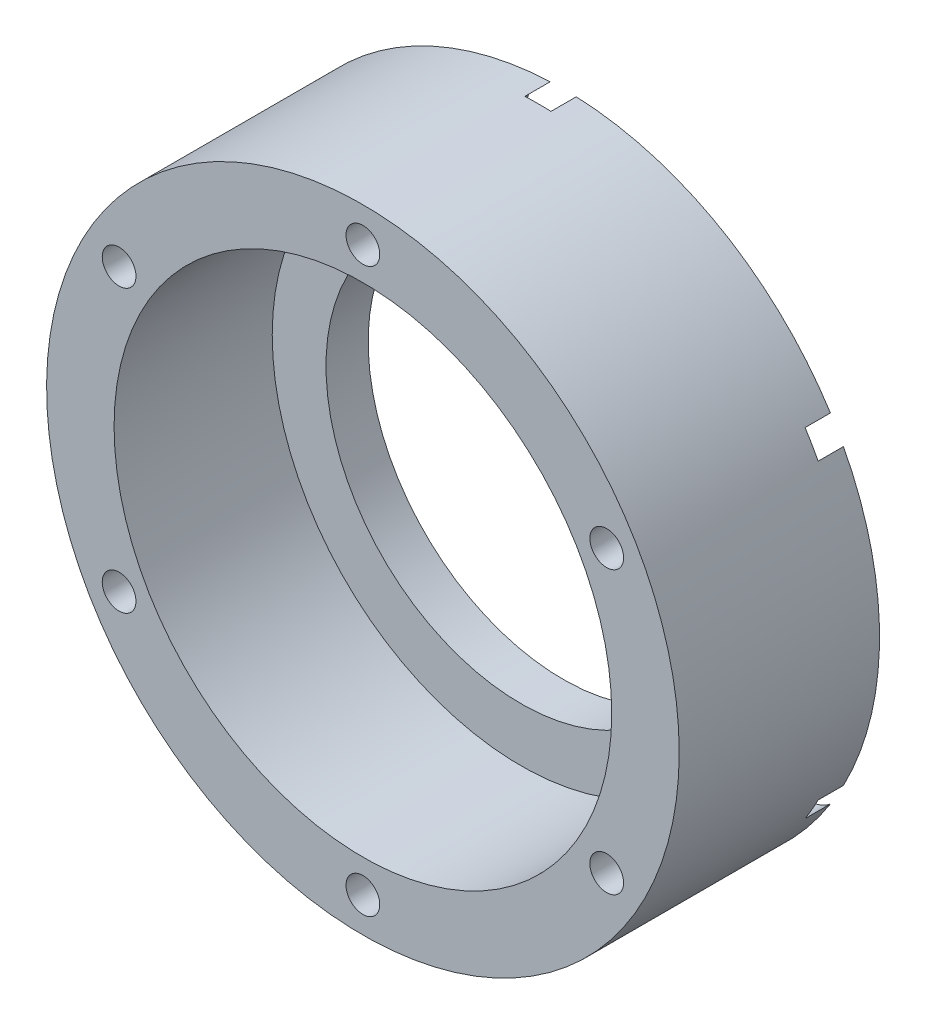
ISO-10303-21;
HEADER;
FILE_DESCRIPTION(('STEP AP214'),'2;1');
FILE_NAME('part.step','',(''),(''),'','','');
FILE_SCHEMA(('AUTOMOTIVE_DESIGN { 1 0 10303 214 1 1 1 1 }'));
ENDSEC;
DATA;
#1=APPLICATION_CONTEXT('core data for automotive mechanical design processes');
#2=APPLICATION_PROTOCOL_DEFINITION('international standard','automotive_design',2000,#1);
#3=PRODUCT_CONTEXT('',#1,'mechanical');
#4=PRODUCT('Part','Part','',(#3));
#5=PRODUCT_RELATED_PRODUCT_CATEGORY('part','',(#4));
#6=PRODUCT_DEFINITION_FORMATION('','',#4);
#7=PRODUCT_DEFINITION_CONTEXT('part definition',#1,'design');
#8=PRODUCT_DEFINITION('design','',#6,#7);
#9=PRODUCT_DEFINITION_SHAPE('','',#8);
#10=(LENGTH_UNIT() NAMED_UNIT(*) SI_UNIT(.MILLI.,.METRE.));
#11=(NAMED_UNIT(*) PLANE_ANGLE_UNIT() SI_UNIT($,.RADIAN.));
#12=(NAMED_UNIT(*) SI_UNIT($,.STERADIAN.) SOLID_ANGLE_UNIT());
#13=UNCERTAINTY_MEASURE_WITH_UNIT(LENGTH_MEASURE(1.E-05),#10,'distance_accuracy_value','');
#14=(GEOMETRIC_REPRESENTATION_CONTEXT(3) GLOBAL_UNCERTAINTY_ASSIGNED_CONTEXT((#13)) GLOBAL_UNIT_ASSIGNED_CONTEXT((#10,
#11,#12)) REPRESENTATION_CONTEXT('',''));
#15=CARTESIAN_POINT('',(0.,0.,0.));
#16=DIRECTION('',(0.,0.,1.));
#17=DIRECTION('',(1.,0.,0.));
#18=AXIS2_PLACEMENT_3D('',#15,#16,#17);
#19=CARTESIAN_POINT('',(0.,0.,0.));
#20=DIRECTION('',(0.,0.,1.));
#21=DIRECTION('',(1.,0.,0.));
#22=AXIS2_PLACEMENT_3D('',#19,#20,#21);
#23=PLANE('',#22);
#24=CARTESIAN_POINT('',(0.,0.,0.));
#25=DIRECTION('',(0.,0.,1.));
#26=DIRECTION('',(1.,0.,0.));
#27=AXIS2_PLACEMENT_3D('',#24,#25,#26);
#28=CIRCLE('',#27,18.5);
#29=CARTESIAN_POINT('',(18.5,0.,0.));
#30=VERTEX_POINT('',#29);
#31=EDGE_CURVE('E160',#30,#30,#28,.T.);
#32=ORIENTED_EDGE('',*,*,#31,.T.);
#33=EDGE_LOOP('',(#32));
#34=FACE_BOUND('',#33,.T.);
#35=CARTESIAN_POINT('',(0.,0.,0.));
#36=DIRECTION('',(0.,0.,1.));
#37=DIRECTION('',(1.,0.,0.));
#38=AXIS2_PLACEMENT_3D('',#35,#36,#37);
#39=CIRCLE('',#38,30.);
#40=CARTESIAN_POINT('',(25.3407575630178,16.0575840689799,0.));
#41=VERTEX_POINT('',#40);
#42=CARTESIAN_POINT('',(1.23589694563197,29.974531835206,0.));
#43=VERTEX_POINT('',#42);
#44=EDGE_CURVE('E145',#41,#43,#39,.T.);
#45=ORIENTED_EDGE('',*,*,#44,.F.);
#46=CARTESIAN_POINT('',(23.1228782810445,13.35,0.));
#47=DIRECTION('',(0.,0.,-1.));
#48=DIRECTION('',(-1.,0.,0.));
#49=AXIS2_PLACEMENT_3D('',#46,#47,#48);
#50=CIRCLE('',#49,3.5);
#51=CARTESIAN_POINT('',(26.5766545086498,13.9169477662261,0.));
#52=VERTEX_POINT('',#51);
#53=EDGE_CURVE('E134',#52,#41,#50,.T.);
#54=ORIENTED_EDGE('',*,*,#53,.F.);
#55=CARTESIAN_POINT('',(26.5766545086498,-13.9169477662261,0.));
#56=VERTEX_POINT('',#55);
#57=EDGE_CURVE('E140',#56,#52,#39,.T.);
#58=ORIENTED_EDGE('',*,*,#57,.F.);
#59=CARTESIAN_POINT('',(23.1228782810445,-13.35,0.));
#60=DIRECTION('',(0.,0.,-1.));
#61=DIRECTION('',(-1.,0.,0.));
#62=AXIS2_PLACEMENT_3D('',#59,#60,#61);
#63=CIRCLE('',#62,3.5);
#64=CARTESIAN_POINT('',(25.3407575630178,-16.0575840689799,0.));
#65=VERTEX_POINT('',#64);
#66=EDGE_CURVE('E184',#65,#56,#63,.T.);
#67=ORIENTED_EDGE('',*,*,#66,.F.);
#68=CARTESIAN_POINT('',(1.23589694563198,-29.974531835206,0.));
#69=VERTEX_POINT('',#68);
#70=EDGE_CURVE('E147',#69,#65,#39,.T.);
#71=ORIENTED_EDGE('',*,*,#70,.F.);
#72=CARTESIAN_POINT('',(0.,-26.7,0.));
#73=DIRECTION('',(0.,0.,-1.));
#74=DIRECTION('',(-1.,0.,0.));
#75=AXIS2_PLACEMENT_3D('',#72,#73,#74);
#76=CIRCLE('',#75,3.5);
#77=CARTESIAN_POINT('',(-1.23589694563198,-29.974531835206,0.));
#78=VERTEX_POINT('',#77);
#79=EDGE_CURVE('E195',#78,#69,#76,.T.);
#80=ORIENTED_EDGE('',*,*,#79,.F.);
#81=CARTESIAN_POINT('',(-25.3407575630178,-16.0575840689799,0.));
#82=VERTEX_POINT('',#81);
#83=EDGE_CURVE('E152',#82,#78,#39,.T.);
#84=ORIENTED_EDGE('',*,*,#83,.F.);
#85=CARTESIAN_POINT('',(-23.1228782810445,-13.35,0.));
#86=DIRECTION('',(0.,0.,-1.));
#87=DIRECTION('',(-1.,0.,0.));
#88=AXIS2_PLACEMENT_3D('',#85,#86,#87);
#89=CIRCLE('',#88,3.5);
#90=CARTESIAN_POINT('',(-26.5766545086498,-13.9169477662261,0.));
#91=VERTEX_POINT('',#90);
#92=EDGE_CURVE('E206',#91,#82,#89,.T.);
#93=ORIENTED_EDGE('',*,*,#92,.F.);
#94=CARTESIAN_POINT('',(-26.5766545086498,13.9169477662261,0.));
#95=VERTEX_POINT('',#94);
#96=EDGE_CURVE('E158',#95,#91,#39,.T.);
#97=ORIENTED_EDGE('',*,*,#96,.F.);
#98=CARTESIAN_POINT('',(-23.1228782810445,13.35,0.));
#99=DIRECTION('',(0.,0.,-1.));
#100=DIRECTION('',(-1.,0.,0.));
#101=AXIS2_PLACEMENT_3D('',#98,#99,#100);
#102=CIRCLE('',#101,3.5);
#103=CARTESIAN_POINT('',(-25.3407575630178,16.0575840689799,0.));
#104=VERTEX_POINT('',#103);
#105=EDGE_CURVE('E217',#104,#95,#102,.T.);
#106=ORIENTED_EDGE('',*,*,#105,.F.);
#107=CARTESIAN_POINT('',(-1.23589694563197,29.974531835206,0.));
#108=VERTEX_POINT('',#107);
#109=EDGE_CURVE('E150',#108,#104,#39,.T.);
#110=ORIENTED_EDGE('',*,*,#109,.F.);
#111=CARTESIAN_POINT('',(0.,26.7,0.));
#112=DIRECTION('',(0.,0.,-1.));
#113=DIRECTION('',(-1.,0.,0.));
#114=AXIS2_PLACEMENT_3D('',#111,#112,#113);
#115=CIRCLE('',#114,3.5);
#116=EDGE_CURVE('E226',#43,#108,#115,.T.);
#117=ORIENTED_EDGE('',*,*,#116,.F.);
#118=EDGE_LOOP('',(#45,#54,#58,#67,#71,#80,#84,#93,#97,#106,#110,#117));
#119=FACE_BOUND('',#118,.T.);
#120=ADVANCED_FACE('F37',(#34,#119),#23,.F.);
#121=CARTESIAN_POINT('',(0.,0.,19.));
#122=DIRECTION('',(0.,0.,1.));
#123=DIRECTION('',(1.,0.,0.));
#124=AXIS2_PLACEMENT_3D('',#121,#122,#123);
#125=PLANE('',#124);
#126=CARTESIAN_POINT('',(23.1228782810445,13.35,19.));
#127=DIRECTION('',(0.,0.,-1.));
#128=DIRECTION('',(-1.,0.,0.));
#129=AXIS2_PLACEMENT_3D('',#126,#127,#128);
#130=CIRCLE('',#129,1.59999999999999);
#131=CARTESIAN_POINT('',(21.5228782810445,13.35,19.));
#132=VERTEX_POINT('',#131);
#133=EDGE_CURVE('E228',#132,#132,#130,.T.);
#134=ORIENTED_EDGE('',*,*,#133,.T.);
#135=EDGE_LOOP('',(#134));
#136=FACE_BOUND('',#135,.T.);
#137=CARTESIAN_POINT('',(0.,26.7,19.));
#138=DIRECTION('',(0.,0.,-1.));
#139=DIRECTION('',(-1.,0.,0.));
#140=AXIS2_PLACEMENT_3D('',#137,#138,#139);
#141=CIRCLE('',#140,1.6);
#142=CARTESIAN_POINT('',(-1.59999999999999,26.7,19.));
#143=VERTEX_POINT('',#142);
#144=EDGE_CURVE('E219',#143,#143,#141,.T.);
#145=ORIENTED_EDGE('',*,*,#144,.T.);
#146=EDGE_LOOP('',(#145));
#147=FACE_BOUND('',#146,.T.);
#148=CARTESIAN_POINT('',(-23.1228782810445,13.35,19.));
#149=DIRECTION('',(0.,0.,-1.));
#150=DIRECTION('',(-1.,0.,0.));
#151=AXIS2_PLACEMENT_3D('',#148,#149,#150);
#152=CIRCLE('',#151,1.59999999999999);
#153=CARTESIAN_POINT('',(-24.7228782810445,13.35,19.));
#154=VERTEX_POINT('',#153);
#155=EDGE_CURVE('E208',#154,#154,#152,.T.);
#156=ORIENTED_EDGE('',*,*,#155,.T.);
#157=EDGE_LOOP('',(#156));
#158=FACE_BOUND('',#157,.T.);
#159=CARTESIAN_POINT('',(-23.1228782810445,-13.35,19.));
#160=DIRECTION('',(0.,0.,-1.));
#161=DIRECTION('',(-1.,0.,0.));
#162=AXIS2_PLACEMENT_3D('',#159,#160,#161);
#163=CIRCLE('',#162,1.59999999999999);
#164=CARTESIAN_POINT('',(-24.7228782810445,-13.35,19.));
#165=VERTEX_POINT('',#164);
#166=EDGE_CURVE('E197',#165,#165,#163,.T.);
#167=ORIENTED_EDGE('',*,*,#166,.T.);
#168=EDGE_LOOP('',(#167));
#169=FACE_BOUND('',#168,.T.);
#170=CARTESIAN_POINT('',(0.,-26.7,19.));
#171=DIRECTION('',(0.,0.,-1.));
#172=DIRECTION('',(-1.,0.,0.));
#173=AXIS2_PLACEMENT_3D('',#170,#171,#172);
#174=CIRCLE('',#173,1.6);
#175=CARTESIAN_POINT('',(-1.6,-26.7,19.));
#176=VERTEX_POINT('',#175);
#177=EDGE_CURVE('E186',#176,#176,#174,.T.);
#178=ORIENTED_EDGE('',*,*,#177,.T.);
#179=EDGE_LOOP('',(#178));
#180=FACE_BOUND('',#179,.T.);
#181=CARTESIAN_POINT('',(0.,0.,19.));
#182=DIRECTION('',(0.,0.,1.));
#183=DIRECTION('',(1.,0.,0.));
#184=AXIS2_PLACEMENT_3D('',#181,#182,#183);
#185=CIRCLE('',#184,23.6);
#186=CARTESIAN_POINT('',(23.6,0.,19.));
#187=VERTEX_POINT('',#186);
#188=EDGE_CURVE('E169',#187,#187,#185,.T.);
#189=ORIENTED_EDGE('',*,*,#188,.F.);
#190=EDGE_LOOP('',(#189));
#191=FACE_BOUND('',#190,.T.);
#192=CARTESIAN_POINT('',(0.,0.,19.));
#193=DIRECTION('',(0.,0.,1.));
#194=DIRECTION('',(1.,0.,0.));
#195=AXIS2_PLACEMENT_3D('',#192,#193,#194);
#196=CIRCLE('',#195,30.);
#197=CARTESIAN_POINT('',(30.,0.,19.));
#198=VERTEX_POINT('',#197);
#199=EDGE_CURVE('E165',#198,#198,#196,.T.);
#200=ORIENTED_EDGE('',*,*,#199,.T.);
#201=EDGE_LOOP('',(#200));
#202=FACE_BOUND('',#201,.T.);
#203=CARTESIAN_POINT('',(23.1228782810445,-13.35,19.));
#204=DIRECTION('',(0.,0.,-1.));
#205=DIRECTION('',(-1.,0.,0.));
#206=AXIS2_PLACEMENT_3D('',#203,#204,#205);
#207=CIRCLE('',#206,1.59999999999999);
#208=CARTESIAN_POINT('',(21.5228782810445,-13.35,19.));
#209=VERTEX_POINT('',#208);
#210=EDGE_CURVE('E173',#209,#209,#207,.T.);
#211=ORIENTED_EDGE('',*,*,#210,.T.);
#212=EDGE_LOOP('',(#211));
#213=FACE_BOUND('',#212,.T.);
#214=ADVANCED_FACE('F307',(#136,#147,#158,#169,#180,#191,#202,#213),#125,.T.);
#215=CARTESIAN_POINT('',(0.,0.,4.));
#216=DIRECTION('',(0.,0.,1.));
#217=DIRECTION('',(1.,0.,0.));
#218=AXIS2_PLACEMENT_3D('',#215,#216,#217);
#219=PLANE('',#218);
#220=CARTESIAN_POINT('',(0.,0.,4.));
#221=DIRECTION('',(0.,0.,1.));
#222=DIRECTION('',(1.,0.,0.));
#223=AXIS2_PLACEMENT_3D('',#220,#221,#222);
#224=CIRCLE('',#223,18.5);
#225=CARTESIAN_POINT('',(18.5,0.,4.));
#226=VERTEX_POINT('',#225);
#227=EDGE_CURVE('E153',#226,#226,#224,.T.);
#228=ORIENTED_EDGE('',*,*,#227,.F.);
#229=EDGE_LOOP('',(#228));
#230=FACE_BOUND('',#229,.T.);
#231=CARTESIAN_POINT('',(0.,0.,4.));
#232=DIRECTION('',(0.,0.,1.));
#233=DIRECTION('',(1.,0.,0.));
#234=AXIS2_PLACEMENT_3D('',#231,#232,#233);
#235=CIRCLE('',#234,23.6);
#236=CARTESIAN_POINT('',(23.6,0.,4.));
#237=VERTEX_POINT('',#236);
#238=EDGE_CURVE('E170',#237,#237,#235,.T.);
#239=ORIENTED_EDGE('',*,*,#238,.T.);
#240=EDGE_LOOP('',(#239));
#241=FACE_BOUND('',#240,.T.);
#242=ADVANCED_FACE('F312',(#230,#241),#219,.T.);
#243=CARTESIAN_POINT('',(0.,0.,4.));
#244=DIRECTION('',(0.,0.,-1.));
#245=DIRECTION('',(-1.,0.,0.));
#246=AXIS2_PLACEMENT_3D('',#243,#244,#245);
#247=CYLINDRICAL_SURFACE('',#246,30.);
#248=ORIENTED_EDGE('',*,*,#57,.T.);
#249=DIRECTION('',(0.,0.,-1.));
#250=VECTOR('',#249,1.);
#251=CARTESIAN_POINT('',(26.5766545086498,13.9169477662261,1.2));
#252=LINE('',#251,#250);
#253=CARTESIAN_POINT('',(26.5766545086498,13.9169477662261,2.4));
#254=VERTEX_POINT('',#253);
#255=EDGE_CURVE('E11',#52,#254,#252,.F.);
#256=ORIENTED_EDGE('',*,*,#255,.T.);
#257=CARTESIAN_POINT('',(0.,0.,2.4));
#258=DIRECTION('',(0.,0.,1.));
#259=DIRECTION('',(1.,0.,0.));
#260=AXIS2_PLACEMENT_3D('',#257,#258,#259);
#261=CIRCLE('',#260,30.);
#262=CARTESIAN_POINT('',(25.3407575630178,16.0575840689799,2.4));
#263=VERTEX_POINT('',#262);
#264=EDGE_CURVE('E124',#254,#263,#261,.T.);
#265=ORIENTED_EDGE('',*,*,#264,.T.);
#266=DIRECTION('',(0.,0.,-1.));
#267=VECTOR('',#266,1.);
#268=CARTESIAN_POINT('',(25.3407575630178,16.0575840689799,1.2));
#269=LINE('',#268,#267);
#270=EDGE_CURVE('E45',#263,#41,#269,.T.);
#271=ORIENTED_EDGE('',*,*,#270,.T.);
#272=ORIENTED_EDGE('',*,*,#44,.T.);
#273=DIRECTION('',(0.,0.,-1.));
#274=VECTOR('',#273,1.);
#275=CARTESIAN_POINT('',(1.23589694563198,29.974531835206,1.2));
#276=LINE('',#275,#274);
#277=CARTESIAN_POINT('',(1.23589694563197,29.974531835206,2.4));
#278=VERTEX_POINT('',#277);
#279=EDGE_CURVE('E128',#43,#278,#276,.F.);
#280=ORIENTED_EDGE('',*,*,#279,.T.);
#281=CARTESIAN_POINT('',(0.,0.,2.4));
#282=DIRECTION('',(0.,0.,1.));
#283=DIRECTION('',(1.,0.,0.));
#284=AXIS2_PLACEMENT_3D('',#281,#282,#283);
#285=CIRCLE('',#284,30.);
#286=CARTESIAN_POINT('',(-1.23589694563197,29.974531835206,2.4));
#287=VERTEX_POINT('',#286);
#288=EDGE_CURVE('E246',#278,#287,#285,.T.);
#289=ORIENTED_EDGE('',*,*,#288,.T.);
#290=DIRECTION('',(0.,0.,-1.));
#291=VECTOR('',#290,1.);
#292=CARTESIAN_POINT('',(-1.23589694563198,29.974531835206,1.2));
#293=LINE('',#292,#291);
#294=EDGE_CURVE('E242',#287,#108,#293,.T.);
#295=ORIENTED_EDGE('',*,*,#294,.T.);
#296=ORIENTED_EDGE('',*,*,#109,.T.);
#297=DIRECTION('',(0.,0.,-1.));
#298=VECTOR('',#297,1.);
#299=CARTESIAN_POINT('',(-25.3407575630178,16.0575840689799,1.2));
#300=LINE('',#299,#298);
#301=CARTESIAN_POINT('',(-25.3407575630178,16.0575840689799,2.4));
#302=VERTEX_POINT('',#301);
#303=EDGE_CURVE('E249',#104,#302,#300,.F.);
#304=ORIENTED_EDGE('',*,*,#303,.T.);
#305=CARTESIAN_POINT('',(0.,0.,2.4));
#306=DIRECTION('',(0.,0.,1.));
#307=DIRECTION('',(1.,0.,0.));
#308=AXIS2_PLACEMENT_3D('',#305,#306,#307);
#309=CIRCLE('',#308,30.);
#310=CARTESIAN_POINT('',(-26.5766545086498,13.9169477662261,2.4));
#311=VERTEX_POINT('',#310);
#312=EDGE_CURVE('E253',#302,#311,#309,.T.);
#313=ORIENTED_EDGE('',*,*,#312,.T.);
#314=DIRECTION('',(0.,0.,-1.));
#315=VECTOR('',#314,1.);
#316=CARTESIAN_POINT('',(-26.5766545086498,13.9169477662261,1.2));
#317=LINE('',#316,#315);
#318=EDGE_CURVE('E256',#311,#95,#317,.T.);
#319=ORIENTED_EDGE('',*,*,#318,.T.);
#320=ORIENTED_EDGE('',*,*,#96,.T.);
#321=DIRECTION('',(0.,0.,-1.));
#322=VECTOR('',#321,1.);
#323=CARTESIAN_POINT('',(-26.5766545086498,-13.9169477662261,1.2));
#324=LINE('',#323,#322);
#325=CARTESIAN_POINT('',(-26.5766545086498,-13.9169477662261,2.4));
#326=VERTEX_POINT('',#325);
#327=EDGE_CURVE('E259',#91,#326,#324,.F.);
#328=ORIENTED_EDGE('',*,*,#327,.T.);
#329=CARTESIAN_POINT('',(0.,0.,2.4));
#330=DIRECTION('',(0.,0.,1.));
#331=DIRECTION('',(1.,0.,0.));
#332=AXIS2_PLACEMENT_3D('',#329,#330,#331);
#333=CIRCLE('',#332,30.);
#334=CARTESIAN_POINT('',(-25.3407575630178,-16.0575840689799,2.4));
#335=VERTEX_POINT('',#334);
#336=EDGE_CURVE('E262',#326,#335,#333,.T.);
#337=ORIENTED_EDGE('',*,*,#336,.T.);
#338=DIRECTION('',(0.,0.,-1.));
#339=VECTOR('',#338,1.);
#340=CARTESIAN_POINT('',(-25.3407575630178,-16.0575840689799,1.2));
#341=LINE('',#340,#339);
#342=EDGE_CURVE('E265',#335,#82,#341,.T.);
#343=ORIENTED_EDGE('',*,*,#342,.T.);
#344=ORIENTED_EDGE('',*,*,#83,.T.);
#345=DIRECTION('',(0.,0.,-1.));
#346=VECTOR('',#345,1.);
#347=CARTESIAN_POINT('',(-1.23589694563198,-29.974531835206,1.2));
#348=LINE('',#347,#346);
#349=CARTESIAN_POINT('',(-1.23589694563198,-29.974531835206,2.4));
#350=VERTEX_POINT('',#349);
#351=EDGE_CURVE('E268',#78,#350,#348,.F.);
#352=ORIENTED_EDGE('',*,*,#351,.T.);
#353=CARTESIAN_POINT('',(0.,0.,2.4));
#354=DIRECTION('',(0.,0.,1.));
#355=DIRECTION('',(1.,0.,0.));
#356=AXIS2_PLACEMENT_3D('',#353,#354,#355);
#357=CIRCLE('',#356,30.);
#358=CARTESIAN_POINT('',(1.23589694563198,-29.974531835206,2.4));
#359=VERTEX_POINT('',#358);
#360=EDGE_CURVE('E271',#350,#359,#357,.T.);
#361=ORIENTED_EDGE('',*,*,#360,.T.);
#362=DIRECTION('',(0.,0.,-1.));
#363=VECTOR('',#362,1.);
#364=CARTESIAN_POINT('',(1.23589694563197,-29.974531835206,1.2));
#365=LINE('',#364,#363);
#366=EDGE_CURVE('E274',#359,#69,#365,.T.);
#367=ORIENTED_EDGE('',*,*,#366,.T.);
#368=ORIENTED_EDGE('',*,*,#70,.T.);
#369=DIRECTION('',(0.,0.,-1.));
#370=VECTOR('',#369,1.);
#371=CARTESIAN_POINT('',(25.3407575630178,-16.0575840689799,1.2));
#372=LINE('',#371,#370);
#373=CARTESIAN_POINT('',(25.3407575630178,-16.0575840689799,2.4));
#374=VERTEX_POINT('',#373);
#375=EDGE_CURVE('E276',#65,#374,#372,.F.);
#376=ORIENTED_EDGE('',*,*,#375,.T.);
#377=CARTESIAN_POINT('',(0.,0.,2.4));
#378=DIRECTION('',(0.,0.,1.));
#379=DIRECTION('',(1.,0.,0.));
#380=AXIS2_PLACEMENT_3D('',#377,#378,#379);
#381=CIRCLE('',#380,30.);
#382=CARTESIAN_POINT('',(26.5766545086498,-13.9169477662261,2.4));
#383=VERTEX_POINT('',#382);
#384=EDGE_CURVE('E148',#374,#383,#381,.T.);
#385=ORIENTED_EDGE('',*,*,#384,.T.);
#386=DIRECTION('',(0.,0.,-1.));
#387=VECTOR('',#386,1.);
#388=CARTESIAN_POINT('',(26.5766545086498,-13.9169477662261,1.2));
#389=LINE('',#388,#387);
#390=EDGE_CURVE('E142',#383,#56,#389,.T.);
#391=ORIENTED_EDGE('',*,*,#390,.T.);
#392=EDGE_LOOP('',(#248,#256,#265,#271,#272,#280,#289,#295,#296,#304,#313,#319,#320,#328,#337,
#343,#344,#352,#361,#367,#368,#376,#385,#391));
#393=FACE_BOUND('',#392,.T.);
#394=ORIENTED_EDGE('',*,*,#199,.F.);
#395=EDGE_LOOP('',(#394));
#396=FACE_BOUND('',#395,.T.);
#397=ADVANCED_FACE('F39',(#393,#396),#247,.T.);
#398=CARTESIAN_POINT('',(0.,0.,4.));
#399=DIRECTION('',(0.,0.,-1.));
#400=DIRECTION('',(-1.,0.,0.));
#401=AXIS2_PLACEMENT_3D('',#398,#399,#400);
#402=CYLINDRICAL_SURFACE('',#401,18.5);
#403=ORIENTED_EDGE('',*,*,#227,.T.);
#404=EDGE_LOOP('',(#403));
#405=FACE_BOUND('',#404,.T.);
#406=ORIENTED_EDGE('',*,*,#31,.F.);
#407=EDGE_LOOP('',(#406));
#408=FACE_BOUND('',#407,.T.);
#409=ADVANCED_FACE('F319',(#405,#408),#402,.F.);
#410=CARTESIAN_POINT('',(0.,0.,19.));
#411=DIRECTION('',(0.,0.,-1.));
#412=DIRECTION('',(-1.,0.,0.));
#413=AXIS2_PLACEMENT_3D('',#410,#411,#412);
#414=CYLINDRICAL_SURFACE('',#413,23.6);
#415=ORIENTED_EDGE('',*,*,#188,.T.);
#416=EDGE_LOOP('',(#415));
#417=FACE_BOUND('',#416,.T.);
#418=ORIENTED_EDGE('',*,*,#238,.F.);
#419=EDGE_LOOP('',(#418));
#420=FACE_BOUND('',#419,.T.);
#421=ADVANCED_FACE('F321',(#417,#420),#414,.F.);
#422=CARTESIAN_POINT('',(24.7228782810445,-13.35,2.4));
#423=DIRECTION('',(0.,0.,1.));
#424=DIRECTION('',(1.,0.,0.));
#425=AXIS2_PLACEMENT_3D('',#422,#423,#424);
#426=PLANE('',#425);
#427=CARTESIAN_POINT('',(23.1228782810445,-13.35,2.4));
#428=DIRECTION('',(0.,0.,-1.));
#429=DIRECTION('',(-1.,0.,0.));
#430=AXIS2_PLACEMENT_3D('',#427,#428,#429);
#431=CIRCLE('',#430,1.60000000000001);
#432=CARTESIAN_POINT('',(21.5228782810445,-13.35,2.4));
#433=VERTEX_POINT('',#432);
#434=EDGE_CURVE('E178',#433,#433,#431,.T.);
#435=ORIENTED_EDGE('',*,*,#434,.F.);
#436=EDGE_LOOP('',(#435));
#437=FACE_BOUND('',#436,.T.);
#438=CARTESIAN_POINT('',(23.1228782810445,-13.35,2.4));
#439=DIRECTION('',(0.,0.,-1.));
#440=DIRECTION('',(-1.,0.,0.));
#441=AXIS2_PLACEMENT_3D('',#438,#439,#440);
#442=CIRCLE('',#441,3.5);
#443=EDGE_CURVE('E181',#374,#383,#442,.T.);
#444=ORIENTED_EDGE('',*,*,#443,.T.);
#445=ORIENTED_EDGE('',*,*,#384,.F.);
#446=EDGE_LOOP('',(#444,#445));
#447=FACE_BOUND('',#446,.T.);
#448=ADVANCED_FACE('F280',(#437,#447),#426,.F.);
#449=CARTESIAN_POINT('',(23.1228782810445,-13.35,0.));
#450=DIRECTION('',(0.,0.,-1.));
#451=DIRECTION('',(-1.,0.,0.));
#452=AXIS2_PLACEMENT_3D('',#449,#450,#451);
#453=CYLINDRICAL_SURFACE('',#452,3.5);
#454=ORIENTED_EDGE('',*,*,#66,.T.);
#455=ORIENTED_EDGE('',*,*,#390,.F.);
#456=ORIENTED_EDGE('',*,*,#443,.F.);
#457=ORIENTED_EDGE('',*,*,#375,.F.);
#458=EDGE_LOOP('',(#454,#455,#456,#457));
#459=FACE_BOUND('',#458,.T.);
#460=ADVANCED_FACE('F282',(#459),#453,.F.);
#461=CARTESIAN_POINT('',(23.1228782810445,-13.35,0.));
#462=DIRECTION('',(0.,0.,-1.));
#463=DIRECTION('',(-1.,0.,0.));
#464=AXIS2_PLACEMENT_3D('',#461,#462,#463);
#465=CYLINDRICAL_SURFACE('',#464,1.6);
#466=ORIENTED_EDGE('',*,*,#210,.F.);
#467=EDGE_LOOP('',(#466));
#468=FACE_BOUND('',#467,.T.);
#469=ORIENTED_EDGE('',*,*,#434,.T.);
#470=EDGE_LOOP('',(#469));
#471=FACE_BOUND('',#470,.T.);
#472=ADVANCED_FACE('F293',(#468,#471),#465,.F.);
#473=CARTESIAN_POINT('',(1.60000000000001,-26.7,2.4));
#474=DIRECTION('',(0.,0.,1.));
#475=DIRECTION('',(1.,0.,0.));
#476=AXIS2_PLACEMENT_3D('',#473,#474,#475);
#477=PLANE('',#476);
#478=CARTESIAN_POINT('',(0.,-26.7,2.4));
#479=DIRECTION('',(0.,0.,-1.));
#480=DIRECTION('',(-1.,0.,0.));
#481=AXIS2_PLACEMENT_3D('',#478,#479,#480);
#482=CIRCLE('',#481,1.60000000000001);
#483=CARTESIAN_POINT('',(-1.60000000000002,-26.7,2.4));
#484=VERTEX_POINT('',#483);
#485=EDGE_CURVE('E189',#484,#484,#482,.T.);
#486=ORIENTED_EDGE('',*,*,#485,.F.);
#487=EDGE_LOOP('',(#486));
#488=FACE_BOUND('',#487,.T.);
#489=CARTESIAN_POINT('',(0.,-26.7,2.4));
#490=DIRECTION('',(0.,0.,-1.));
#491=DIRECTION('',(-1.,0.,0.));
#492=AXIS2_PLACEMENT_3D('',#489,#490,#491);
#493=CIRCLE('',#492,3.5);
#494=EDGE_CURVE('E192',#350,#359,#493,.T.);
#495=ORIENTED_EDGE('',*,*,#494,.T.);
#496=ORIENTED_EDGE('',*,*,#360,.F.);
#497=EDGE_LOOP('',(#495,#496));
#498=FACE_BOUND('',#497,.T.);
#499=ADVANCED_FACE('F291',(#488,#498),#477,.F.);
#500=CARTESIAN_POINT('',(0.,-26.7,0.));
#501=DIRECTION('',(0.,0.,-1.));
#502=DIRECTION('',(-1.,0.,0.));
#503=AXIS2_PLACEMENT_3D('',#500,#501,#502);
#504=CYLINDRICAL_SURFACE('',#503,3.5);
#505=ORIENTED_EDGE('',*,*,#79,.T.);
#506=ORIENTED_EDGE('',*,*,#366,.F.);
#507=ORIENTED_EDGE('',*,*,#494,.F.);
#508=ORIENTED_EDGE('',*,*,#351,.F.);
#509=EDGE_LOOP('',(#505,#506,#507,#508));
#510=FACE_BOUND('',#509,.T.);
#511=ADVANCED_FACE('F288',(#510),#504,.F.);
#512=CARTESIAN_POINT('',(0.,-26.7,0.));
#513=DIRECTION('',(0.,0.,-1.));
#514=DIRECTION('',(-1.,0.,0.));
#515=AXIS2_PLACEMENT_3D('',#512,#513,#514);
#516=CYLINDRICAL_SURFACE('',#515,1.6);
#517=ORIENTED_EDGE('',*,*,#177,.F.);
#518=EDGE_LOOP('',(#517));
#519=FACE_BOUND('',#518,.T.);
#520=ORIENTED_EDGE('',*,*,#485,.T.);
#521=EDGE_LOOP('',(#520));
#522=FACE_BOUND('',#521,.T.);
#523=ADVANCED_FACE('F300',(#519,#522),#516,.F.);
#524=CARTESIAN_POINT('',(-21.5228782810445,-13.35,2.4));
#525=DIRECTION('',(0.,0.,1.));
#526=DIRECTION('',(1.,0.,0.));
#527=AXIS2_PLACEMENT_3D('',#524,#525,#526);
#528=PLANE('',#527);
#529=CARTESIAN_POINT('',(-23.1228782810445,-13.35,2.4));
#530=DIRECTION('',(0.,0.,-1.));
#531=DIRECTION('',(-1.,0.,0.));
#532=AXIS2_PLACEMENT_3D('',#529,#530,#531);
#533=CIRCLE('',#532,1.60000000000001);
#534=CARTESIAN_POINT('',(-24.7228782810445,-13.35,2.4));
#535=VERTEX_POINT('',#534);
#536=EDGE_CURVE('E200',#535,#535,#533,.T.);
#537=ORIENTED_EDGE('',*,*,#536,.F.);
#538=EDGE_LOOP('',(#537));
#539=FACE_BOUND('',#538,.T.);
#540=CARTESIAN_POINT('',(-23.1228782810445,-13.35,2.4));
#541=DIRECTION('',(0.,0.,-1.));
#542=DIRECTION('',(-1.,0.,0.));
#543=AXIS2_PLACEMENT_3D('',#540,#541,#542);
#544=CIRCLE('',#543,3.5);
#545=EDGE_CURVE('E203',#326,#335,#544,.T.);
#546=ORIENTED_EDGE('',*,*,#545,.T.);
#547=ORIENTED_EDGE('',*,*,#336,.F.);
#548=EDGE_LOOP('',(#546,#547));
#549=FACE_BOUND('',#548,.T.);
#550=ADVANCED_FACE('F331',(#539,#549),#528,.F.);
#551=CARTESIAN_POINT('',(-23.1228782810445,-13.35,0.));
#552=DIRECTION('',(0.,0.,-1.));
#553=DIRECTION('',(-1.,0.,0.));
#554=AXIS2_PLACEMENT_3D('',#551,#552,#553);
#555=CYLINDRICAL_SURFACE('',#554,3.5);
#556=ORIENTED_EDGE('',*,*,#92,.T.);
#557=ORIENTED_EDGE('',*,*,#342,.F.);
#558=ORIENTED_EDGE('',*,*,#545,.F.);
#559=ORIENTED_EDGE('',*,*,#327,.F.);
#560=EDGE_LOOP('',(#556,#557,#558,#559));
#561=FACE_BOUND('',#560,.T.);
#562=ADVANCED_FACE('F336',(#561),#555,.F.);
#563=CARTESIAN_POINT('',(-23.1228782810445,-13.35,0.));
#564=DIRECTION('',(0.,0.,-1.));
#565=DIRECTION('',(-1.,0.,0.));
#566=AXIS2_PLACEMENT_3D('',#563,#564,#565);
#567=CYLINDRICAL_SURFACE('',#566,1.6);
#568=ORIENTED_EDGE('',*,*,#166,.F.);
#569=EDGE_LOOP('',(#568));
#570=FACE_BOUND('',#569,.T.);
#571=ORIENTED_EDGE('',*,*,#536,.T.);
#572=EDGE_LOOP('',(#571));
#573=FACE_BOUND('',#572,.T.);
#574=ADVANCED_FACE('F410',(#570,#573),#567,.F.);
#575=CARTESIAN_POINT('',(-21.5228782810445,13.35,2.4));
#576=DIRECTION('',(0.,0.,1.));
#577=DIRECTION('',(1.,0.,0.));
#578=AXIS2_PLACEMENT_3D('',#575,#576,#577);
#579=PLANE('',#578);
#580=CARTESIAN_POINT('',(-23.1228782810445,13.35,2.4));
#581=DIRECTION('',(0.,0.,-1.));
#582=DIRECTION('',(-1.,0.,0.));
#583=AXIS2_PLACEMENT_3D('',#580,#581,#582);
#584=CIRCLE('',#583,1.60000000000001);
#585=CARTESIAN_POINT('',(-24.7228782810445,13.35,2.4));
#586=VERTEX_POINT('',#585);
#587=EDGE_CURVE('E211',#586,#586,#584,.T.);
#588=ORIENTED_EDGE('',*,*,#587,.F.);
#589=EDGE_LOOP('',(#588));
#590=FACE_BOUND('',#589,.T.);
#591=CARTESIAN_POINT('',(-23.1228782810445,13.35,2.4));
#592=DIRECTION('',(0.,0.,-1.));
#593=DIRECTION('',(-1.,0.,0.));
#594=AXIS2_PLACEMENT_3D('',#591,#592,#593);
#595=CIRCLE('',#594,3.5);
#596=EDGE_CURVE('E214',#302,#311,#595,.T.);
#597=ORIENTED_EDGE('',*,*,#596,.T.);
#598=ORIENTED_EDGE('',*,*,#312,.F.);
#599=EDGE_LOOP('',(#597,#598));
#600=FACE_BOUND('',#599,.T.);
#601=ADVANCED_FACE('F421',(#590,#600),#579,.F.);
#602=CARTESIAN_POINT('',(-23.1228782810445,13.35,0.));
#603=DIRECTION('',(0.,0.,-1.));
#604=DIRECTION('',(-1.,0.,0.));
#605=AXIS2_PLACEMENT_3D('',#602,#603,#604);
#606=CYLINDRICAL_SURFACE('',#605,3.5);
#607=ORIENTED_EDGE('',*,*,#105,.T.);
#608=ORIENTED_EDGE('',*,*,#318,.F.);
#609=ORIENTED_EDGE('',*,*,#596,.F.);
#610=ORIENTED_EDGE('',*,*,#303,.F.);
#611=EDGE_LOOP('',(#607,#608,#609,#610));
#612=FACE_BOUND('',#611,.T.);
#613=ADVANCED_FACE('F432',(#612),#606,.F.);
#614=CARTESIAN_POINT('',(-23.1228782810445,13.35,0.));
#615=DIRECTION('',(0.,0.,-1.));
#616=DIRECTION('',(-1.,0.,0.));
#617=AXIS2_PLACEMENT_3D('',#614,#615,#616);
#618=CYLINDRICAL_SURFACE('',#617,1.6);
#619=ORIENTED_EDGE('',*,*,#155,.F.);
#620=EDGE_LOOP('',(#619));
#621=FACE_BOUND('',#620,.T.);
#622=ORIENTED_EDGE('',*,*,#587,.T.);
#623=EDGE_LOOP('',(#622));
#624=FACE_BOUND('',#623,.T.);
#625=ADVANCED_FACE('F443',(#621,#624),#618,.F.);
#626=CARTESIAN_POINT('',(0.,26.7,0.));
#627=DIRECTION('',(0.,0.,-1.));
#628=DIRECTION('',(-1.,0.,0.));
#629=AXIS2_PLACEMENT_3D('',#626,#627,#628);
#630=CYLINDRICAL_SURFACE('',#629,3.5);
#631=ORIENTED_EDGE('',*,*,#116,.T.);
#632=ORIENTED_EDGE('',*,*,#294,.F.);
#633=CARTESIAN_POINT('',(0.,26.7,2.4));
#634=DIRECTION('',(0.,0.,-1.));
#635=DIRECTION('',(-1.,0.,0.));
#636=AXIS2_PLACEMENT_3D('',#633,#634,#635);
#637=CIRCLE('',#636,3.5);
#638=EDGE_CURVE('E58',#278,#287,#637,.T.);
#639=ORIENTED_EDGE('',*,*,#638,.F.);
#640=ORIENTED_EDGE('',*,*,#279,.F.);
#641=EDGE_LOOP('',(#631,#632,#639,#640));
#642=FACE_BOUND('',#641,.T.);
#643=ADVANCED_FACE('F241',(#642),#630,.F.);
#644=CARTESIAN_POINT('',(1.60000000000001,26.7,2.4));
#645=DIRECTION('',(0.,0.,1.));
#646=DIRECTION('',(1.,0.,0.));
#647=AXIS2_PLACEMENT_3D('',#644,#645,#646);
#648=PLANE('',#647);
#649=CARTESIAN_POINT('',(0.,26.7,2.4));
#650=DIRECTION('',(0.,0.,-1.));
#651=DIRECTION('',(-1.,0.,0.));
#652=AXIS2_PLACEMENT_3D('',#649,#650,#651);
#653=CIRCLE('',#652,1.60000000000001);
#654=CARTESIAN_POINT('',(-1.60000000000001,26.7,2.4));
#655=VERTEX_POINT('',#654);
#656=EDGE_CURVE('E222',#655,#655,#653,.T.);
#657=ORIENTED_EDGE('',*,*,#656,.F.);
#658=EDGE_LOOP('',(#657));
#659=FACE_BOUND('',#658,.T.);
#660=ORIENTED_EDGE('',*,*,#638,.T.);
#661=ORIENTED_EDGE('',*,*,#288,.F.);
#662=EDGE_LOOP('',(#660,#661));
#663=FACE_BOUND('',#662,.T.);
#664=ADVANCED_FACE('F464',(#659,#663),#648,.F.);
#665=CARTESIAN_POINT('',(0.,26.7,0.));
#666=DIRECTION('',(0.,0.,-1.));
#667=DIRECTION('',(-1.,0.,0.));
#668=AXIS2_PLACEMENT_3D('',#665,#666,#667);
#669=CYLINDRICAL_SURFACE('',#668,1.6);
#670=ORIENTED_EDGE('',*,*,#144,.F.);
#671=EDGE_LOOP('',(#670));
#672=FACE_BOUND('',#671,.T.);
#673=ORIENTED_EDGE('',*,*,#656,.T.);
#674=EDGE_LOOP('',(#673));
#675=FACE_BOUND('',#674,.T.);
#676=ADVANCED_FACE('F474',(#672,#675),#669,.F.);
#677=CARTESIAN_POINT('',(23.1228782810445,13.35,0.));
#678=DIRECTION('',(0.,0.,-1.));
#679=DIRECTION('',(-1.,0.,0.));
#680=AXIS2_PLACEMENT_3D('',#677,#678,#679);
#681=CYLINDRICAL_SURFACE('',#680,3.5);
#682=ORIENTED_EDGE('',*,*,#53,.T.);
#683=ORIENTED_EDGE('',*,*,#270,.F.);
#684=CARTESIAN_POINT('',(23.1228782810445,13.35,2.4));
#685=DIRECTION('',(0.,0.,-1.));
#686=DIRECTION('',(-1.,0.,0.));
#687=AXIS2_PLACEMENT_3D('',#684,#685,#686);
#688=CIRCLE('',#687,3.5);
#689=EDGE_CURVE('E51',#254,#263,#688,.T.);
#690=ORIENTED_EDGE('',*,*,#689,.F.);
#691=ORIENTED_EDGE('',*,*,#255,.F.);
#692=EDGE_LOOP('',(#682,#683,#690,#691));
#693=FACE_BOUND('',#692,.T.);
#694=ADVANCED_FACE('F131',(#693),#681,.F.);
#695=CARTESIAN_POINT('',(24.7228782810445,13.35,2.4));
#696=DIRECTION('',(0.,0.,1.));
#697=DIRECTION('',(1.,0.,0.));
#698=AXIS2_PLACEMENT_3D('',#695,#696,#697);
#699=PLANE('',#698);
#700=CARTESIAN_POINT('',(23.1228782810445,13.35,2.4));
#701=DIRECTION('',(0.,0.,-1.));
#702=DIRECTION('',(-1.,0.,0.));
#703=AXIS2_PLACEMENT_3D('',#700,#701,#702);
#704=CIRCLE('',#703,1.60000000000001);
#705=CARTESIAN_POINT('',(21.5228782810445,13.35,2.4));
#706=VERTEX_POINT('',#705);
#707=EDGE_CURVE('E133',#706,#706,#704,.T.);
#708=ORIENTED_EDGE('',*,*,#707,.F.);
#709=EDGE_LOOP('',(#708));
#710=FACE_BOUND('',#709,.T.);
#711=ORIENTED_EDGE('',*,*,#689,.T.);
#712=ORIENTED_EDGE('',*,*,#264,.F.);
#713=EDGE_LOOP('',(#711,#712));
#714=FACE_BOUND('',#713,.T.);
#715=ADVANCED_FACE('F125',(#710,#714),#699,.F.);
#716=CARTESIAN_POINT('',(23.1228782810445,13.35,0.));
#717=DIRECTION('',(0.,0.,-1.));
#718=DIRECTION('',(-1.,0.,0.));
#719=AXIS2_PLACEMENT_3D('',#716,#717,#718);
#720=CYLINDRICAL_SURFACE('',#719,1.6);
#721=ORIENTED_EDGE('',*,*,#133,.F.);
#722=EDGE_LOOP('',(#721));
#723=FACE_BOUND('',#722,.T.);
#724=ORIENTED_EDGE('',*,*,#707,.T.);
#725=EDGE_LOOP('',(#724));
#726=FACE_BOUND('',#725,.T.);
#727=ADVANCED_FACE('F504',(#723,#726),#720,.F.);
#728=CLOSED_SHELL('',(#120,#214,#242,#397,#409,#421,#448,#460,#472,#499,#511,#523,#550,#562,
#574,#601,#613,#625,#643,#664,#676,#694,#715,#727));
#729=MANIFOLD_SOLID_BREP('B2',#728);
#730=ADVANCED_BREP_SHAPE_REPRESENTATION('',(#18,#729),#14);
#731=SHAPE_DEFINITION_REPRESENTATION(#9,#730);
ENDSEC;
END-ISO-10303-21;
